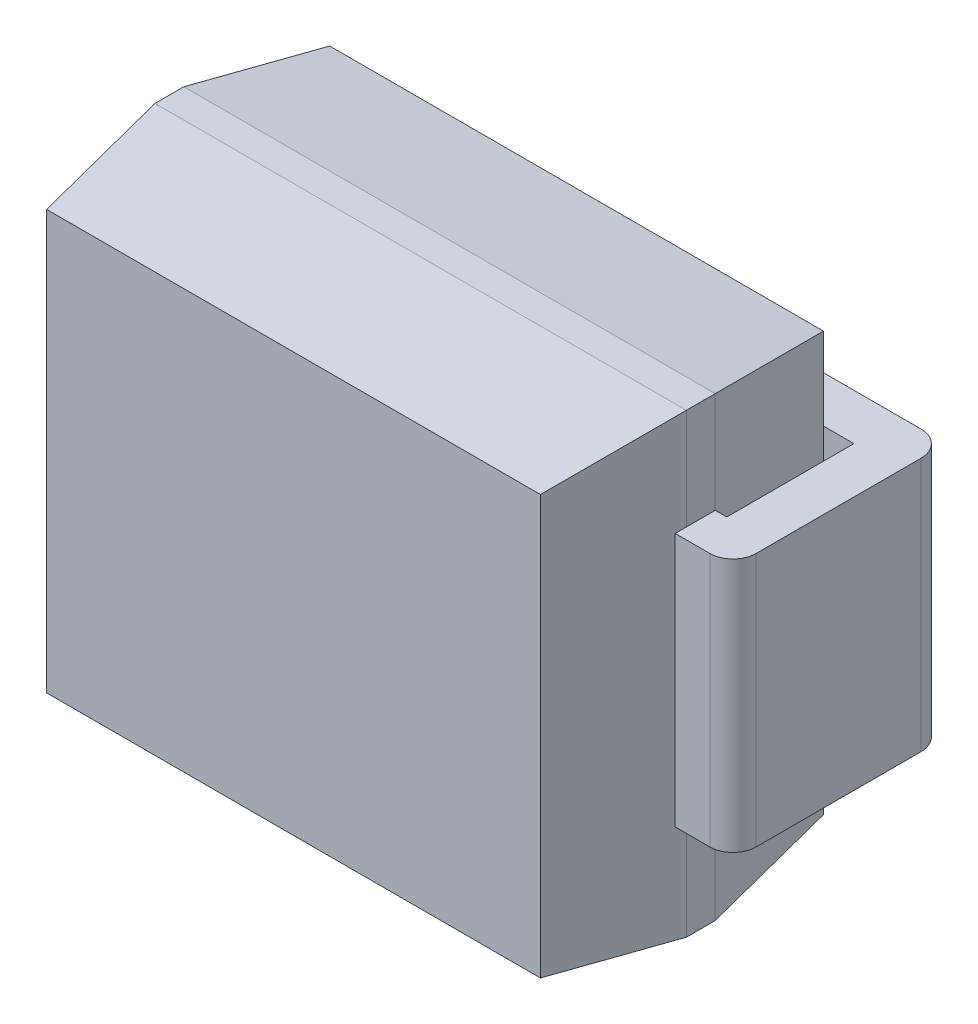
ISO-10303-21;
HEADER;
FILE_DESCRIPTION(('STEP AP214'),'2;1');
FILE_NAME('part.step','',(''),(''),'','','');
FILE_SCHEMA(('AUTOMOTIVE_DESIGN { 1 0 10303 214 1 1 1 1 }'));
ENDSEC;
DATA;
#1=APPLICATION_CONTEXT('core data for automotive mechanical design processes');
#2=APPLICATION_PROTOCOL_DEFINITION('international standard','automotive_design',2000,#1);
#3=PRODUCT_CONTEXT('',#1,'mechanical');
#4=PRODUCT('Part','Part','',(#3));
#5=PRODUCT_RELATED_PRODUCT_CATEGORY('part','',(#4));
#6=PRODUCT_DEFINITION_FORMATION('','',#4);
#7=PRODUCT_DEFINITION_CONTEXT('part definition',#1,'design');
#8=PRODUCT_DEFINITION('design','',#6,#7);
#9=PRODUCT_DEFINITION_SHAPE('','',#8);
#10=(LENGTH_UNIT() NAMED_UNIT(*) SI_UNIT(.MILLI.,.METRE.));
#11=(NAMED_UNIT(*) PLANE_ANGLE_UNIT() SI_UNIT($,.RADIAN.));
#12=(NAMED_UNIT(*) SI_UNIT($,.STERADIAN.) SOLID_ANGLE_UNIT());
#13=UNCERTAINTY_MEASURE_WITH_UNIT(LENGTH_MEASURE(1.E-05),#10,'distance_accuracy_value','');
#14=(GEOMETRIC_REPRESENTATION_CONTEXT(3) GLOBAL_UNCERTAINTY_ASSIGNED_CONTEXT((#13)) GLOBAL_UNIT_ASSIGNED_CONTEXT((#10,
#11,#12)) REPRESENTATION_CONTEXT('',''));
#15=CARTESIAN_POINT('',(0.,0.,0.));
#16=DIRECTION('',(0.,0.,1.));
#17=DIRECTION('',(1.,0.,0.));
#18=AXIS2_PLACEMENT_3D('',#15,#16,#17);
#19=CARTESIAN_POINT('',(2.3,-1.1,1.8464101615138));
#20=DIRECTION('',(-1.,0.,0.));
#21=DIRECTION('',(0.,0.,-1.));
#22=AXIS2_PLACEMENT_3D('',#19,#20,#21);
#23=PLANE('',#22);
#24=DIRECTION('',(0.,1.,0.));
#25=VECTOR('',#24,1.);
#26=CARTESIAN_POINT('',(2.3,-1.1,1.50000000000002));
#27=LINE('',#26,#25);
#28=CARTESIAN_POINT('',(2.3,-1.1,1.50000000000002));
#29=VERTEX_POINT('',#28);
#30=CARTESIAN_POINT('',(2.3,1.1,1.50000000000002));
#31=VERTEX_POINT('',#30);
#32=EDGE_CURVE('E53',#29,#31,#27,.T.);
#33=ORIENTED_EDGE('',*,*,#32,.F.);
#34=DIRECTION('',(0.,0.,-1.));
#35=VECTOR('',#34,1.);
#36=CARTESIAN_POINT('',(2.3,-1.1,1.8464101615138));
#37=LINE('',#36,#35);
#38=CARTESIAN_POINT('',(2.3,-1.1,1.8464101615138));
#39=VERTEX_POINT('',#38);
#40=EDGE_CURVE('E199',#39,#29,#37,.T.);
#41=ORIENTED_EDGE('',*,*,#40,.F.);
#42=DIRECTION('',(0.,1.,0.));
#43=VECTOR('',#42,1.);
#44=CARTESIAN_POINT('',(2.3,-1.1,1.8464101615138));
#45=LINE('',#44,#43);
#46=CARTESIAN_POINT('',(2.3,1.1,1.8464101615138));
#47=VERTEX_POINT('',#46);
#48=EDGE_CURVE('E12',#39,#47,#45,.T.);
#49=ORIENTED_EDGE('',*,*,#48,.T.);
#50=DIRECTION('',(0.,0.,-1.));
#51=VECTOR('',#50,1.);
#52=CARTESIAN_POINT('',(2.3,1.1,1.8464101615138));
#53=LINE('',#52,#51);
#54=EDGE_CURVE('E132',#47,#31,#53,.T.);
#55=ORIENTED_EDGE('',*,*,#54,.T.);
#56=EDGE_LOOP('',(#33,#41,#49,#55));
#57=FACE_BOUND('',#56,.T.);
#58=ADVANCED_FACE('F50',(#57),#23,.T.);
#59=CARTESIAN_POINT('',(2.6,-1.1,1.8464101615138));
#60=DIRECTION('',(0.,0.,1.));
#61=DIRECTION('',(-1.,0.,0.));
#62=AXIS2_PLACEMENT_3D('',#59,#60,#61);
#63=PLANE('',#62);
#64=ORIENTED_EDGE('',*,*,#48,.F.);
#65=DIRECTION('',(-1.,0.,0.));
#66=VECTOR('',#65,1.);
#67=CARTESIAN_POINT('',(2.6,-1.1,1.8464101615138));
#68=LINE('',#67,#66);
#69=CARTESIAN_POINT('',(2.6,-1.1,1.8464101615138));
#70=VERTEX_POINT('',#69);
#71=EDGE_CURVE('E66',#70,#39,#68,.T.);
#72=ORIENTED_EDGE('',*,*,#71,.F.);
#73=DIRECTION('',(0.,1.,0.));
#74=VECTOR('',#73,1.);
#75=CARTESIAN_POINT('',(2.6,-1.1,1.8464101615138));
#76=LINE('',#75,#74);
#77=CARTESIAN_POINT('',(2.6,1.1,1.8464101615138));
#78=VERTEX_POINT('',#77);
#79=EDGE_CURVE('E58',#70,#78,#76,.T.);
#80=ORIENTED_EDGE('',*,*,#79,.T.);
#81=DIRECTION('',(-1.,0.,0.));
#82=VECTOR('',#81,1.);
#83=CARTESIAN_POINT('',(2.6,1.1,1.8464101615138));
#84=LINE('',#83,#82);
#85=EDGE_CURVE('E197',#78,#47,#84,.T.);
#86=ORIENTED_EDGE('',*,*,#85,.T.);
#87=EDGE_LOOP('',(#64,#72,#80,#86));
#88=FACE_BOUND('',#87,.T.);
#89=ADVANCED_FACE('F221',(#88),#63,.T.);
#90=CARTESIAN_POINT('',(2.6,-1.1,1.6464101615138));
#91=DIRECTION('',(0.,1.,0.));
#92=DIRECTION('',(0.,0.,1.));
#93=AXIS2_PLACEMENT_3D('',#90,#91,#92);
#94=CYLINDRICAL_SURFACE('',#93,0.2);
#95=ORIENTED_EDGE('',*,*,#79,.F.);
#96=CARTESIAN_POINT('',(2.6,-1.1,1.6464101615138));
#97=DIRECTION('',(0.,-1.,0.));
#98=DIRECTION('',(0.,0.,-1.));
#99=AXIS2_PLACEMENT_3D('',#96,#97,#98);
#100=CIRCLE('',#99,0.2);
#101=CARTESIAN_POINT('',(2.8,-1.1,1.6464101615138));
#102=VERTEX_POINT('',#101);
#103=EDGE_CURVE('E71',#102,#70,#100,.T.);
#104=ORIENTED_EDGE('',*,*,#103,.F.);
#105=DIRECTION('',(0.,1.,0.));
#106=VECTOR('',#105,1.);
#107=CARTESIAN_POINT('',(2.8,-1.1,1.6464101615138));
#108=LINE('',#107,#106);
#109=CARTESIAN_POINT('',(2.8,1.1,1.6464101615138));
#110=VERTEX_POINT('',#109);
#111=EDGE_CURVE('E155',#102,#110,#108,.T.);
#112=ORIENTED_EDGE('',*,*,#111,.T.);
#113=CARTESIAN_POINT('',(2.6,1.1,1.6464101615138));
#114=DIRECTION('',(0.,-1.,0.));
#115=DIRECTION('',(0.,0.,-1.));
#116=AXIS2_PLACEMENT_3D('',#113,#114,#115);
#117=CIRCLE('',#116,0.2);
#118=EDGE_CURVE('E195',#110,#78,#117,.T.);
#119=ORIENTED_EDGE('',*,*,#118,.T.);
#120=EDGE_LOOP('',(#95,#104,#112,#119));
#121=FACE_BOUND('',#120,.T.);
#122=ADVANCED_FACE('F219',(#121),#94,.T.);
#123=CARTESIAN_POINT('',(2.8,-1.1,1.6464101615138));
#124=DIRECTION('',(1.,0.,0.));
#125=DIRECTION('',(0.,0.,1.));
#126=AXIS2_PLACEMENT_3D('',#123,#124,#125);
#127=PLANE('',#126);
#128=ORIENTED_EDGE('',*,*,#111,.F.);
#129=DIRECTION('',(0.,0.,1.));
#130=VECTOR('',#129,1.);
#131=CARTESIAN_POINT('',(2.8,-1.1,1.6464101615138));
#132=LINE('',#131,#130);
#133=CARTESIAN_POINT('',(2.8,-1.1,0.22));
#134=VERTEX_POINT('',#133);
#135=EDGE_CURVE('E149',#134,#102,#132,.T.);
#136=ORIENTED_EDGE('',*,*,#135,.F.);
#137=DIRECTION('',(0.,1.,0.));
#138=VECTOR('',#137,1.);
#139=CARTESIAN_POINT('',(2.8,-1.1,0.22));
#140=LINE('',#139,#138);
#141=CARTESIAN_POINT('',(2.8,1.1,0.22));
#142=VERTEX_POINT('',#141);
#143=EDGE_CURVE('E158',#134,#142,#140,.T.);
#144=ORIENTED_EDGE('',*,*,#143,.T.);
#145=DIRECTION('',(0.,0.,1.));
#146=VECTOR('',#145,1.);
#147=CARTESIAN_POINT('',(2.8,1.1,1.6464101615138));
#148=LINE('',#147,#146);
#149=EDGE_CURVE('E193',#142,#110,#148,.T.);
#150=ORIENTED_EDGE('',*,*,#149,.T.);
#151=EDGE_LOOP('',(#128,#136,#144,#150));
#152=FACE_BOUND('',#151,.T.);
#153=ADVANCED_FACE('F215',(#152),#127,.T.);
#154=CARTESIAN_POINT('',(2.58,-1.1,0.22));
#155=DIRECTION('',(0.,1.,0.));
#156=DIRECTION('',(0.,0.,1.));
#157=AXIS2_PLACEMENT_3D('',#154,#155,#156);
#158=CYLINDRICAL_SURFACE('',#157,0.22);
#159=ORIENTED_EDGE('',*,*,#143,.F.);
#160=CARTESIAN_POINT('',(2.58,-1.1,0.22));
#161=DIRECTION('',(0.,-1.,0.));
#162=DIRECTION('',(0.,0.,1.));
#163=AXIS2_PLACEMENT_3D('',#160,#161,#162);
#164=CIRCLE('',#163,0.22);
#165=CARTESIAN_POINT('',(2.58,-1.1,0.));
#166=VERTEX_POINT('',#165);
#167=EDGE_CURVE('E208',#166,#134,#164,.T.);
#168=ORIENTED_EDGE('',*,*,#167,.F.);
#169=DIRECTION('',(0.,1.,0.));
#170=VECTOR('',#169,1.);
#171=CARTESIAN_POINT('',(2.58,-1.1,0.));
#172=LINE('',#171,#170);
#173=CARTESIAN_POINT('',(2.58,1.1,0.));
#174=VERTEX_POINT('',#173);
#175=EDGE_CURVE('E161',#166,#174,#172,.T.);
#176=ORIENTED_EDGE('',*,*,#175,.T.);
#177=CARTESIAN_POINT('',(2.58,1.1,0.22));
#178=DIRECTION('',(0.,-1.,0.));
#179=DIRECTION('',(0.,0.,1.));
#180=AXIS2_PLACEMENT_3D('',#177,#178,#179);
#181=CIRCLE('',#180,0.22);
#182=EDGE_CURVE('E191',#174,#142,#181,.T.);
#183=ORIENTED_EDGE('',*,*,#182,.T.);
#184=EDGE_LOOP('',(#159,#168,#176,#183));
#185=FACE_BOUND('',#184,.T.);
#186=ADVANCED_FACE('F232',(#185),#158,.T.);
#187=CARTESIAN_POINT('',(1.3,-1.1,0.));
#188=DIRECTION('',(0.,0.,-1.));
#189=DIRECTION('',(1.,0.,0.));
#190=AXIS2_PLACEMENT_3D('',#187,#188,#189);
#191=PLANE('',#190);
#192=ORIENTED_EDGE('',*,*,#175,.F.);
#193=DIRECTION('',(1.,0.,0.));
#194=VECTOR('',#193,1.);
#195=CARTESIAN_POINT('',(1.3,-1.1,0.));
#196=LINE('',#195,#194);
#197=CARTESIAN_POINT('',(1.3,-1.1,0.));
#198=VERTEX_POINT('',#197);
#199=EDGE_CURVE('E206',#198,#166,#196,.T.);
#200=ORIENTED_EDGE('',*,*,#199,.F.);
#201=DIRECTION('',(0.,1.,0.));
#202=VECTOR('',#201,1.);
#203=CARTESIAN_POINT('',(1.3,-1.1,0.));
#204=LINE('',#203,#202);
#205=CARTESIAN_POINT('',(1.3,1.1,0.));
#206=VERTEX_POINT('',#205);
#207=EDGE_CURVE('E164',#198,#206,#204,.T.);
#208=ORIENTED_EDGE('',*,*,#207,.T.);
#209=DIRECTION('',(1.,0.,0.));
#210=VECTOR('',#209,1.);
#211=CARTESIAN_POINT('',(1.3,1.1,0.));
#212=LINE('',#211,#210);
#213=EDGE_CURVE('E187',#206,#174,#212,.T.);
#214=ORIENTED_EDGE('',*,*,#213,.T.);
#215=EDGE_LOOP('',(#192,#200,#208,#214));
#216=FACE_BOUND('',#215,.T.);
#217=ADVANCED_FACE('F229',(#216),#191,.T.);
#218=CARTESIAN_POINT('',(1.3,-1.1,0.));
#219=DIRECTION('',(-1.,0.,0.));
#220=DIRECTION('',(0.,0.,-1.));
#221=AXIS2_PLACEMENT_3D('',#218,#219,#220);
#222=PLANE('',#221);
#223=ORIENTED_EDGE('',*,*,#207,.F.);
#224=DIRECTION('',(0.,0.,-1.));
#225=VECTOR('',#224,1.);
#226=CARTESIAN_POINT('',(1.3,-1.1,0.));
#227=LINE('',#226,#225);
#228=CARTESIAN_POINT('',(1.3,-1.1,0.4));
#229=VERTEX_POINT('',#228);
#230=EDGE_CURVE('E204',#229,#198,#227,.T.);
#231=ORIENTED_EDGE('',*,*,#230,.F.);
#232=DIRECTION('',(0.,1.,0.));
#233=VECTOR('',#232,1.);
#234=CARTESIAN_POINT('',(1.3,-1.1,0.4));
#235=LINE('',#234,#233);
#236=CARTESIAN_POINT('',(1.3,1.1,0.4));
#237=VERTEX_POINT('',#236);
#238=EDGE_CURVE('E167',#229,#237,#235,.T.);
#239=ORIENTED_EDGE('',*,*,#238,.T.);
#240=DIRECTION('',(0.,0.,-1.));
#241=VECTOR('',#240,1.);
#242=CARTESIAN_POINT('',(1.3,1.1,0.));
#243=LINE('',#242,#241);
#244=EDGE_CURVE('E185',#237,#206,#243,.T.);
#245=ORIENTED_EDGE('',*,*,#244,.T.);
#246=EDGE_LOOP('',(#223,#231,#239,#245));
#247=FACE_BOUND('',#246,.T.);
#248=ADVANCED_FACE('F225',(#247),#222,.T.);
#249=CARTESIAN_POINT('',(1.3,-1.1,0.4));
#250=DIRECTION('',(0.,0.,1.));
#251=DIRECTION('',(-1.,0.,0.));
#252=AXIS2_PLACEMENT_3D('',#249,#250,#251);
#253=PLANE('',#252);
#254=ORIENTED_EDGE('',*,*,#238,.F.);
#255=DIRECTION('',(-1.,0.,0.));
#256=VECTOR('',#255,1.);
#257=CARTESIAN_POINT('',(1.3,-1.1,0.4));
#258=LINE('',#257,#256);
#259=CARTESIAN_POINT('',(2.4,-1.1,0.4));
#260=VERTEX_POINT('',#259);
#261=EDGE_CURVE('E178',#260,#229,#258,.T.);
#262=ORIENTED_EDGE('',*,*,#261,.F.);
#263=DIRECTION('',(0.,1.,0.));
#264=VECTOR('',#263,1.);
#265=CARTESIAN_POINT('',(2.4,-1.1,0.4));
#266=LINE('',#265,#264);
#267=CARTESIAN_POINT('',(2.4,1.1,0.4));
#268=VERTEX_POINT('',#267);
#269=EDGE_CURVE('E147',#260,#268,#266,.T.);
#270=ORIENTED_EDGE('',*,*,#269,.T.);
#271=DIRECTION('',(-1.,0.,0.));
#272=VECTOR('',#271,1.);
#273=CARTESIAN_POINT('',(1.3,1.1,0.4));
#274=LINE('',#273,#272);
#275=EDGE_CURVE('E176',#268,#237,#274,.T.);
#276=ORIENTED_EDGE('',*,*,#275,.T.);
#277=EDGE_LOOP('',(#254,#262,#270,#276));
#278=FACE_BOUND('',#277,.T.);
#279=ADVANCED_FACE('F175',(#278),#253,.T.);
#280=CARTESIAN_POINT('',(2.4,-1.1,0.4));
#281=DIRECTION('',(-1.,0.,0.));
#282=DIRECTION('',(0.,0.,-1.));
#283=AXIS2_PLACEMENT_3D('',#280,#281,#282);
#284=PLANE('',#283);
#285=ORIENTED_EDGE('',*,*,#269,.F.);
#286=DIRECTION('',(0.,0.,-1.));
#287=VECTOR('',#286,1.);
#288=CARTESIAN_POINT('',(2.4,-1.1,0.4));
#289=LINE('',#288,#287);
#290=CARTESIAN_POINT('',(2.4,-1.1,1.50000000000002));
#291=VERTEX_POINT('',#290);
#292=EDGE_CURVE('E182',#291,#260,#289,.T.);
#293=ORIENTED_EDGE('',*,*,#292,.F.);
#294=DIRECTION('',(0.,1.,0.));
#295=VECTOR('',#294,1.);
#296=CARTESIAN_POINT('',(2.4,-1.1,1.50000000000002));
#297=LINE('',#296,#295);
#298=CARTESIAN_POINT('',(2.4,1.1,1.50000000000002));
#299=VERTEX_POINT('',#298);
#300=EDGE_CURVE('E146',#291,#299,#297,.T.);
#301=ORIENTED_EDGE('',*,*,#300,.T.);
#302=DIRECTION('',(0.,0.,-1.));
#303=VECTOR('',#302,1.);
#304=CARTESIAN_POINT('',(2.4,1.1,0.4));
#305=LINE('',#304,#303);
#306=EDGE_CURVE('E134',#299,#268,#305,.T.);
#307=ORIENTED_EDGE('',*,*,#306,.T.);
#308=EDGE_LOOP('',(#285,#293,#301,#307));
#309=FACE_BOUND('',#308,.T.);
#310=ADVANCED_FACE('F181',(#309),#284,.T.);
#311=CARTESIAN_POINT('',(2.3,-1.1,1.50000000000002));
#312=DIRECTION('',(0.,0.,-1.));
#313=DIRECTION('',(1.,0.,0.));
#314=AXIS2_PLACEMENT_3D('',#311,#312,#313);
#315=PLANE('',#314);
#316=ORIENTED_EDGE('',*,*,#300,.F.);
#317=DIRECTION('',(1.,0.,0.));
#318=VECTOR('',#317,1.);
#319=CARTESIAN_POINT('',(2.3,-1.1,1.50000000000002));
#320=LINE('',#319,#318);
#321=EDGE_CURVE('E145',#29,#291,#320,.T.);
#322=ORIENTED_EDGE('',*,*,#321,.F.);
#323=ORIENTED_EDGE('',*,*,#32,.T.);
#324=DIRECTION('',(1.,0.,0.));
#325=VECTOR('',#324,1.);
#326=CARTESIAN_POINT('',(2.3,1.1,1.50000000000002));
#327=LINE('',#326,#325);
#328=EDGE_CURVE('E128',#31,#299,#327,.T.);
#329=ORIENTED_EDGE('',*,*,#328,.T.);
#330=EDGE_LOOP('',(#316,#322,#323,#329));
#331=FACE_BOUND('',#330,.T.);
#332=ADVANCED_FACE('F144',(#331),#315,.T.);
#333=CARTESIAN_POINT('',(2.58,-1.1,0.22));
#334=DIRECTION('',(0.,1.,0.));
#335=DIRECTION('',(0.,0.,1.));
#336=AXIS2_PLACEMENT_3D('',#333,#334,#335);
#337=PLANE('',#336);
#338=ORIENTED_EDGE('',*,*,#40,.T.);
#339=ORIENTED_EDGE('',*,*,#321,.T.);
#340=ORIENTED_EDGE('',*,*,#292,.T.);
#341=ORIENTED_EDGE('',*,*,#261,.T.);
#342=ORIENTED_EDGE('',*,*,#230,.T.);
#343=ORIENTED_EDGE('',*,*,#199,.T.);
#344=ORIENTED_EDGE('',*,*,#167,.T.);
#345=ORIENTED_EDGE('',*,*,#135,.T.);
#346=ORIENTED_EDGE('',*,*,#103,.T.);
#347=ORIENTED_EDGE('',*,*,#71,.T.);
#348=EDGE_LOOP('',(#338,#339,#340,#341,#342,#343,#344,#345,#346,#347));
#349=FACE_BOUND('',#348,.T.);
#350=ADVANCED_FACE('F211',(#349),#337,.F.);
#351=CARTESIAN_POINT('',(2.58,1.1,0.22));
#352=DIRECTION('',(0.,1.,0.));
#353=DIRECTION('',(0.,0.,1.));
#354=AXIS2_PLACEMENT_3D('',#351,#352,#353);
#355=PLANE('',#354);
#356=ORIENTED_EDGE('',*,*,#54,.F.);
#357=ORIENTED_EDGE('',*,*,#85,.F.);
#358=ORIENTED_EDGE('',*,*,#118,.F.);
#359=ORIENTED_EDGE('',*,*,#149,.F.);
#360=ORIENTED_EDGE('',*,*,#182,.F.);
#361=ORIENTED_EDGE('',*,*,#213,.F.);
#362=ORIENTED_EDGE('',*,*,#244,.F.);
#363=ORIENTED_EDGE('',*,*,#275,.F.);
#364=ORIENTED_EDGE('',*,*,#306,.F.);
#365=ORIENTED_EDGE('',*,*,#328,.F.);
#366=EDGE_LOOP('',(#356,#357,#358,#359,#360,#361,#362,#363,#364,#365));
#367=FACE_BOUND('',#366,.T.);
#368=ADVANCED_FACE('F130',(#367),#355,.T.);
#369=CLOSED_SHELL('',(#58,#89,#122,#153,#186,#217,#248,#279,#310,#332,#350,#368));
#370=MANIFOLD_SOLID_BREP('B2',#369);
#371=CARTESIAN_POINT('',(-2.3,-1.1,1.8464101615138));
#372=DIRECTION('',(1.,0.,0.));
#373=DIRECTION('',(0.,0.,-1.));
#374=AXIS2_PLACEMENT_3D('',#371,#372,#373);
#375=PLANE('',#374);
#376=DIRECTION('',(0.,1.,0.));
#377=VECTOR('',#376,1.);
#378=CARTESIAN_POINT('',(-2.3,-1.1,1.50000000000002));
#379=LINE('',#378,#377);
#380=CARTESIAN_POINT('',(-2.3,-1.1,1.50000000000002));
#381=VERTEX_POINT('',#380);
#382=CARTESIAN_POINT('',(-2.3,1.1,1.50000000000002));
#383=VERTEX_POINT('',#382);
#384=EDGE_CURVE('E366',#381,#383,#379,.T.);
#385=ORIENTED_EDGE('',*,*,#384,.T.);
#386=DIRECTION('',(0.,0.,-1.));
#387=VECTOR('',#386,1.);
#388=CARTESIAN_POINT('',(-2.3,1.1,1.8464101615138));
#389=LINE('',#388,#387);
#390=CARTESIAN_POINT('',(-2.3,1.1,1.8464101615138));
#391=VERTEX_POINT('',#390);
#392=EDGE_CURVE('E439',#391,#383,#389,.T.);
#393=ORIENTED_EDGE('',*,*,#392,.F.);
#394=DIRECTION('',(0.,1.,0.));
#395=VECTOR('',#394,1.);
#396=CARTESIAN_POINT('',(-2.3,-1.1,1.8464101615138));
#397=LINE('',#396,#395);
#398=CARTESIAN_POINT('',(-2.3,-1.1,1.8464101615138));
#399=VERTEX_POINT('',#398);
#400=EDGE_CURVE('E48',#399,#391,#397,.T.);
#401=ORIENTED_EDGE('',*,*,#400,.F.);
#402=DIRECTION('',(0.,0.,-1.));
#403=VECTOR('',#402,1.);
#404=CARTESIAN_POINT('',(-2.3,-1.1,1.8464101615138));
#405=LINE('',#404,#403);
#406=EDGE_CURVE('E440',#399,#381,#405,.T.);
#407=ORIENTED_EDGE('',*,*,#406,.T.);
#408=EDGE_LOOP('',(#385,#393,#401,#407));
#409=FACE_BOUND('',#408,.T.);
#410=ADVANCED_FACE('F363',(#409),#375,.T.);
#411=CARTESIAN_POINT('',(-2.6,-1.1,1.8464101615138));
#412=DIRECTION('',(0.,0.,1.));
#413=DIRECTION('',(1.,0.,0.));
#414=AXIS2_PLACEMENT_3D('',#411,#412,#413);
#415=PLANE('',#414);
#416=ORIENTED_EDGE('',*,*,#400,.T.);
#417=DIRECTION('',(1.,0.,0.));
#418=VECTOR('',#417,1.);
#419=CARTESIAN_POINT('',(-2.6,1.1,1.8464101615138));
#420=LINE('',#419,#418);
#421=CARTESIAN_POINT('',(-2.6,1.1,1.8464101615138));
#422=VERTEX_POINT('',#421);
#423=EDGE_CURVE('E457',#422,#391,#420,.T.);
#424=ORIENTED_EDGE('',*,*,#423,.F.);
#425=DIRECTION('',(0.,1.,0.));
#426=VECTOR('',#425,1.);
#427=CARTESIAN_POINT('',(-2.6,-1.1,1.8464101615138));
#428=LINE('',#427,#426);
#429=CARTESIAN_POINT('',(-2.6,-1.1,1.8464101615138));
#430=VERTEX_POINT('',#429);
#431=EDGE_CURVE('E371',#430,#422,#428,.T.);
#432=ORIENTED_EDGE('',*,*,#431,.F.);
#433=DIRECTION('',(1.,0.,0.));
#434=VECTOR('',#433,1.);
#435=CARTESIAN_POINT('',(-2.6,-1.1,1.8464101615138));
#436=LINE('',#435,#434);
#437=EDGE_CURVE('E445',#430,#399,#436,.T.);
#438=ORIENTED_EDGE('',*,*,#437,.T.);
#439=EDGE_LOOP('',(#416,#424,#432,#438));
#440=FACE_BOUND('',#439,.T.);
#441=ADVANCED_FACE('F545',(#440),#415,.T.);
#442=CARTESIAN_POINT('',(-2.6,-1.1,1.6464101615138));
#443=DIRECTION('',(0.,1.,0.));
#444=DIRECTION('',(0.,0.,1.));
#445=AXIS2_PLACEMENT_3D('',#442,#443,#444);
#446=CYLINDRICAL_SURFACE('',#445,0.2);
#447=ORIENTED_EDGE('',*,*,#431,.T.);
#448=CARTESIAN_POINT('',(-2.6,1.1,1.6464101615138));
#449=DIRECTION('',(0.,1.,0.));
#450=DIRECTION('',(0.,0.,-1.));
#451=AXIS2_PLACEMENT_3D('',#448,#449,#450);
#452=CIRCLE('',#451,0.2);
#453=CARTESIAN_POINT('',(-2.8,1.1,1.6464101615138));
#454=VERTEX_POINT('',#453);
#455=EDGE_CURVE('E476',#454,#422,#452,.T.);
#456=ORIENTED_EDGE('',*,*,#455,.F.);
#457=DIRECTION('',(0.,1.,0.));
#458=VECTOR('',#457,1.);
#459=CARTESIAN_POINT('',(-2.8,-1.1,1.6464101615138));
#460=LINE('',#459,#458);
#461=CARTESIAN_POINT('',(-2.8,-1.1,1.6464101615138));
#462=VERTEX_POINT('',#461);
#463=EDGE_CURVE('E504',#462,#454,#460,.T.);
#464=ORIENTED_EDGE('',*,*,#463,.F.);
#465=CARTESIAN_POINT('',(-2.6,-1.1,1.6464101615138));
#466=DIRECTION('',(0.,1.,0.));
#467=DIRECTION('',(0.,0.,-1.));
#468=AXIS2_PLACEMENT_3D('',#465,#466,#467);
#469=CIRCLE('',#468,0.2);
#470=EDGE_CURVE('E500',#462,#430,#469,.T.);
#471=ORIENTED_EDGE('',*,*,#470,.T.);
#472=EDGE_LOOP('',(#447,#456,#464,#471));
#473=FACE_BOUND('',#472,.T.);
#474=ADVANCED_FACE('F543',(#473),#446,.T.);
#475=CARTESIAN_POINT('',(-2.8,-1.1,1.6464101615138));
#476=DIRECTION('',(-1.,0.,0.));
#477=DIRECTION('',(0.,0.,1.));
#478=AXIS2_PLACEMENT_3D('',#475,#476,#477);
#479=PLANE('',#478);
#480=ORIENTED_EDGE('',*,*,#463,.T.);
#481=DIRECTION('',(0.,0.,1.));
#482=VECTOR('',#481,1.);
#483=CARTESIAN_POINT('',(-2.8,1.1,1.6464101615138));
#484=LINE('',#483,#482);
#485=CARTESIAN_POINT('',(-2.8,1.1,0.22));
#486=VERTEX_POINT('',#485);
#487=EDGE_CURVE('E473',#486,#454,#484,.T.);
#488=ORIENTED_EDGE('',*,*,#487,.F.);
#489=DIRECTION('',(0.,1.,0.));
#490=VECTOR('',#489,1.);
#491=CARTESIAN_POINT('',(-2.8,-1.1,0.22));
#492=LINE('',#491,#490);
#493=CARTESIAN_POINT('',(-2.8,-1.1,0.22));
#494=VERTEX_POINT('',#493);
#495=EDGE_CURVE('E506',#494,#486,#492,.T.);
#496=ORIENTED_EDGE('',*,*,#495,.F.);
#497=DIRECTION('',(0.,0.,1.));
#498=VECTOR('',#497,1.);
#499=CARTESIAN_POINT('',(-2.8,-1.1,1.6464101615138));
#500=LINE('',#499,#498);
#501=EDGE_CURVE('E497',#494,#462,#500,.T.);
#502=ORIENTED_EDGE('',*,*,#501,.T.);
#503=EDGE_LOOP('',(#480,#488,#496,#502));
#504=FACE_BOUND('',#503,.T.);
#505=ADVANCED_FACE('F539',(#504),#479,.T.);
#506=CARTESIAN_POINT('',(-2.58,-1.1,0.22));
#507=DIRECTION('',(0.,1.,0.));
#508=DIRECTION('',(0.,0.,1.));
#509=AXIS2_PLACEMENT_3D('',#506,#507,#508);
#510=CYLINDRICAL_SURFACE('',#509,0.22);
#511=ORIENTED_EDGE('',*,*,#495,.T.);
#512=CARTESIAN_POINT('',(-2.58,1.1,0.22));
#513=DIRECTION('',(0.,1.,0.));
#514=DIRECTION('',(0.,0.,1.));
#515=AXIS2_PLACEMENT_3D('',#512,#513,#514);
#516=CIRCLE('',#515,0.22);
#517=CARTESIAN_POINT('',(-2.58,1.1,0.));
#518=VERTEX_POINT('',#517);
#519=EDGE_CURVE('E470',#518,#486,#516,.T.);
#520=ORIENTED_EDGE('',*,*,#519,.F.);
#521=DIRECTION('',(0.,1.,0.));
#522=VECTOR('',#521,1.);
#523=CARTESIAN_POINT('',(-2.58,-1.1,0.));
#524=LINE('',#523,#522);
#525=CARTESIAN_POINT('',(-2.58,-1.1,0.));
#526=VERTEX_POINT('',#525);
#527=EDGE_CURVE('E508',#526,#518,#524,.T.);
#528=ORIENTED_EDGE('',*,*,#527,.F.);
#529=CARTESIAN_POINT('',(-2.58,-1.1,0.22));
#530=DIRECTION('',(0.,1.,0.));
#531=DIRECTION('',(0.,0.,1.));
#532=AXIS2_PLACEMENT_3D('',#529,#530,#531);
#533=CIRCLE('',#532,0.22);
#534=EDGE_CURVE('E494',#526,#494,#533,.T.);
#535=ORIENTED_EDGE('',*,*,#534,.T.);
#536=EDGE_LOOP('',(#511,#520,#528,#535));
#537=FACE_BOUND('',#536,.T.);
#538=ADVANCED_FACE('F537',(#537),#510,.T.);
#539=CARTESIAN_POINT('',(-1.3,-1.1,0.));
#540=DIRECTION('',(0.,0.,-1.));
#541=DIRECTION('',(-1.,0.,0.));
#542=AXIS2_PLACEMENT_3D('',#539,#540,#541);
#543=PLANE('',#542);
#544=ORIENTED_EDGE('',*,*,#527,.T.);
#545=DIRECTION('',(-1.,0.,0.));
#546=VECTOR('',#545,1.);
#547=CARTESIAN_POINT('',(-1.3,1.1,0.));
#548=LINE('',#547,#546);
#549=CARTESIAN_POINT('',(-1.3,1.1,0.));
#550=VERTEX_POINT('',#549);
#551=EDGE_CURVE('E467',#550,#518,#548,.T.);
#552=ORIENTED_EDGE('',*,*,#551,.F.);
#553=DIRECTION('',(0.,1.,0.));
#554=VECTOR('',#553,1.);
#555=CARTESIAN_POINT('',(-1.3,-1.1,0.));
#556=LINE('',#555,#554);
#557=CARTESIAN_POINT('',(-1.3,-1.1,0.));
#558=VERTEX_POINT('',#557);
#559=EDGE_CURVE('E510',#558,#550,#556,.T.);
#560=ORIENTED_EDGE('',*,*,#559,.F.);
#561=DIRECTION('',(-1.,0.,0.));
#562=VECTOR('',#561,1.);
#563=CARTESIAN_POINT('',(-1.3,-1.1,0.));
#564=LINE('',#563,#562);
#565=EDGE_CURVE('E491',#558,#526,#564,.T.);
#566=ORIENTED_EDGE('',*,*,#565,.T.);
#567=EDGE_LOOP('',(#544,#552,#560,#566));
#568=FACE_BOUND('',#567,.T.);
#569=ADVANCED_FACE('F532',(#568),#543,.T.);
#570=CARTESIAN_POINT('',(-1.3,-1.1,0.));
#571=DIRECTION('',(1.,0.,0.));
#572=DIRECTION('',(0.,0.,-1.));
#573=AXIS2_PLACEMENT_3D('',#570,#571,#572);
#574=PLANE('',#573);
#575=ORIENTED_EDGE('',*,*,#559,.T.);
#576=DIRECTION('',(0.,0.,-1.));
#577=VECTOR('',#576,1.);
#578=CARTESIAN_POINT('',(-1.3,1.1,0.));
#579=LINE('',#578,#577);
#580=CARTESIAN_POINT('',(-1.3,1.1,0.4));
#581=VERTEX_POINT('',#580);
#582=EDGE_CURVE('E464',#581,#550,#579,.T.);
#583=ORIENTED_EDGE('',*,*,#582,.F.);
#584=DIRECTION('',(0.,1.,0.));
#585=VECTOR('',#584,1.);
#586=CARTESIAN_POINT('',(-1.3,-1.1,0.4));
#587=LINE('',#586,#585);
#588=CARTESIAN_POINT('',(-1.3,-1.1,0.4));
#589=VERTEX_POINT('',#588);
#590=EDGE_CURVE('E512',#589,#581,#587,.T.);
#591=ORIENTED_EDGE('',*,*,#590,.F.);
#592=DIRECTION('',(0.,0.,-1.));
#593=VECTOR('',#592,1.);
#594=CARTESIAN_POINT('',(-1.3,-1.1,0.));
#595=LINE('',#594,#593);
#596=EDGE_CURVE('E488',#589,#558,#595,.T.);
#597=ORIENTED_EDGE('',*,*,#596,.T.);
#598=EDGE_LOOP('',(#575,#583,#591,#597));
#599=FACE_BOUND('',#598,.T.);
#600=ADVANCED_FACE('F525',(#599),#574,.T.);
#601=CARTESIAN_POINT('',(-1.3,-1.1,0.4));
#602=DIRECTION('',(0.,0.,1.));
#603=DIRECTION('',(1.,0.,0.));
#604=AXIS2_PLACEMENT_3D('',#601,#602,#603);
#605=PLANE('',#604);
#606=ORIENTED_EDGE('',*,*,#590,.T.);
#607=DIRECTION('',(1.,0.,0.));
#608=VECTOR('',#607,1.);
#609=CARTESIAN_POINT('',(-1.3,1.1,0.4));
#610=LINE('',#609,#608);
#611=CARTESIAN_POINT('',(-2.4,1.1,0.4));
#612=VERTEX_POINT('',#611);
#613=EDGE_CURVE('E461',#612,#581,#610,.T.);
#614=ORIENTED_EDGE('',*,*,#613,.F.);
#615=DIRECTION('',(0.,1.,0.));
#616=VECTOR('',#615,1.);
#617=CARTESIAN_POINT('',(-2.4,-1.1,0.4));
#618=LINE('',#617,#616);
#619=CARTESIAN_POINT('',(-2.4,-1.1,0.4));
#620=VERTEX_POINT('',#619);
#621=EDGE_CURVE('E514',#620,#612,#618,.T.);
#622=ORIENTED_EDGE('',*,*,#621,.F.);
#623=DIRECTION('',(1.,0.,0.));
#624=VECTOR('',#623,1.);
#625=CARTESIAN_POINT('',(-1.3,-1.1,0.4));
#626=LINE('',#625,#624);
#627=EDGE_CURVE('E485',#620,#589,#626,.T.);
#628=ORIENTED_EDGE('',*,*,#627,.T.);
#629=EDGE_LOOP('',(#606,#614,#622,#628));
#630=FACE_BOUND('',#629,.T.);
#631=ADVANCED_FACE('F522',(#630),#605,.T.);
#632=CARTESIAN_POINT('',(-2.4,-1.1,0.4));
#633=DIRECTION('',(1.,0.,0.));
#634=DIRECTION('',(0.,0.,-1.));
#635=AXIS2_PLACEMENT_3D('',#632,#633,#634);
#636=PLANE('',#635);
#637=ORIENTED_EDGE('',*,*,#621,.T.);
#638=DIRECTION('',(0.,0.,-1.));
#639=VECTOR('',#638,1.);
#640=CARTESIAN_POINT('',(-2.4,1.1,0.4));
#641=LINE('',#640,#639);
#642=CARTESIAN_POINT('',(-2.4,1.1,1.50000000000002));
#643=VERTEX_POINT('',#642);
#644=EDGE_CURVE('E452',#643,#612,#641,.T.);
#645=ORIENTED_EDGE('',*,*,#644,.F.);
#646=DIRECTION('',(0.,1.,0.));
#647=VECTOR('',#646,1.);
#648=CARTESIAN_POINT('',(-2.4,-1.1,1.50000000000002));
#649=LINE('',#648,#647);
#650=CARTESIAN_POINT('',(-2.4,-1.1,1.50000000000002));
#651=VERTEX_POINT('',#650);
#652=EDGE_CURVE('E444',#651,#643,#649,.T.);
#653=ORIENTED_EDGE('',*,*,#652,.F.);
#654=DIRECTION('',(0.,0.,-1.));
#655=VECTOR('',#654,1.);
#656=CARTESIAN_POINT('',(-2.4,-1.1,0.4));
#657=LINE('',#656,#655);
#658=EDGE_CURVE('E482',#651,#620,#657,.T.);
#659=ORIENTED_EDGE('',*,*,#658,.T.);
#660=EDGE_LOOP('',(#637,#645,#653,#659));
#661=FACE_BOUND('',#660,.T.);
#662=ADVANCED_FACE('F516',(#661),#636,.T.);
#663=CARTESIAN_POINT('',(-2.3,-1.1,1.50000000000002));
#664=DIRECTION('',(0.,0.,-1.));
#665=DIRECTION('',(-1.,0.,0.));
#666=AXIS2_PLACEMENT_3D('',#663,#664,#665);
#667=PLANE('',#666);
#668=ORIENTED_EDGE('',*,*,#652,.T.);
#669=DIRECTION('',(-1.,0.,0.));
#670=VECTOR('',#669,1.);
#671=CARTESIAN_POINT('',(-2.3,1.1,1.50000000000002));
#672=LINE('',#671,#670);
#673=EDGE_CURVE('E447',#383,#643,#672,.T.);
#674=ORIENTED_EDGE('',*,*,#673,.F.);
#675=ORIENTED_EDGE('',*,*,#384,.F.);
#676=DIRECTION('',(-1.,0.,0.));
#677=VECTOR('',#676,1.);
#678=CARTESIAN_POINT('',(-2.3,-1.1,1.50000000000002));
#679=LINE('',#678,#677);
#680=EDGE_CURVE('E480',#381,#651,#679,.T.);
#681=ORIENTED_EDGE('',*,*,#680,.T.);
#682=EDGE_LOOP('',(#668,#674,#675,#681));
#683=FACE_BOUND('',#682,.T.);
#684=ADVANCED_FACE('F448',(#683),#667,.T.);
#685=CARTESIAN_POINT('',(-2.58,-1.1,0.22));
#686=DIRECTION('',(0.,1.,0.));
#687=DIRECTION('',(0.,0.,1.));
#688=AXIS2_PLACEMENT_3D('',#685,#686,#687);
#689=PLANE('',#688);
#690=ORIENTED_EDGE('',*,*,#406,.F.);
#691=ORIENTED_EDGE('',*,*,#437,.F.);
#692=ORIENTED_EDGE('',*,*,#470,.F.);
#693=ORIENTED_EDGE('',*,*,#501,.F.);
#694=ORIENTED_EDGE('',*,*,#534,.F.);
#695=ORIENTED_EDGE('',*,*,#565,.F.);
#696=ORIENTED_EDGE('',*,*,#596,.F.);
#697=ORIENTED_EDGE('',*,*,#627,.F.);
#698=ORIENTED_EDGE('',*,*,#658,.F.);
#699=ORIENTED_EDGE('',*,*,#680,.F.);
#700=EDGE_LOOP('',(#690,#691,#692,#693,#694,#695,#696,#697,#698,#699));
#701=FACE_BOUND('',#700,.T.);
#702=ADVANCED_FACE('F528',(#701),#689,.F.);
#703=CARTESIAN_POINT('',(-2.58,1.1,0.22));
#704=DIRECTION('',(0.,1.,0.));
#705=DIRECTION('',(0.,0.,1.));
#706=AXIS2_PLACEMENT_3D('',#703,#704,#705);
#707=PLANE('',#706);
#708=ORIENTED_EDGE('',*,*,#392,.T.);
#709=ORIENTED_EDGE('',*,*,#673,.T.);
#710=ORIENTED_EDGE('',*,*,#644,.T.);
#711=ORIENTED_EDGE('',*,*,#613,.T.);
#712=ORIENTED_EDGE('',*,*,#582,.T.);
#713=ORIENTED_EDGE('',*,*,#551,.T.);
#714=ORIENTED_EDGE('',*,*,#519,.T.);
#715=ORIENTED_EDGE('',*,*,#487,.T.);
#716=ORIENTED_EDGE('',*,*,#455,.T.);
#717=ORIENTED_EDGE('',*,*,#423,.T.);
#718=EDGE_LOOP('',(#708,#709,#710,#711,#712,#713,#714,#715,#716,#717));
#719=FACE_BOUND('',#718,.T.);
#720=ADVANCED_FACE('F455',(#719),#707,.T.);
#721=CLOSED_SHELL('',(#410,#441,#474,#505,#538,#569,#600,#631,#662,#684,#702,#720));
#722=MANIFOLD_SOLID_BREP('B6',#721);
#723=CARTESIAN_POINT('',(2.3,1.975,2.85));
#724=DIRECTION('',(-1.,0.,0.));
#725=DIRECTION('',(0.,-1.,0.));
#726=AXIS2_PLACEMENT_3D('',#723,#724,#725);
#727=PLANE('',#726);
#728=DIRECTION('',(0.,0.,-1.));
#729=VECTOR('',#728,1.);
#730=CARTESIAN_POINT('',(2.3,-1.975,2.85));
#731=LINE('',#730,#729);
#732=CARTESIAN_POINT('',(2.3,-1.975,1.74999999999998));
#733=VERTEX_POINT('',#732);
#734=CARTESIAN_POINT('',(2.3,-1.975,1.50000000000002));
#735=VERTEX_POINT('',#734);
#736=EDGE_CURVE('E754',#733,#735,#731,.T.);
#737=ORIENTED_EDGE('',*,*,#736,.T.);
#738=DIRECTION('',(0.,1.,0.));
#739=VECTOR('',#738,1.);
#740=CARTESIAN_POINT('',(2.3,1.975,1.50000000000002));
#741=LINE('',#740,#739);
#742=CARTESIAN_POINT('',(2.3,1.975,1.50000000000002));
#743=VERTEX_POINT('',#742);
#744=EDGE_CURVE('E747',#735,#743,#741,.T.);
#745=ORIENTED_EDGE('',*,*,#744,.T.);
#746=DIRECTION('',(0.,0.,-1.));
#747=VECTOR('',#746,1.);
#748=CARTESIAN_POINT('',(2.3,1.975,2.85));
#749=LINE('',#748,#747);
#750=CARTESIAN_POINT('',(2.3,1.975,1.74999999999998));
#751=VERTEX_POINT('',#750);
#752=EDGE_CURVE('E731',#751,#743,#749,.T.);
#753=ORIENTED_EDGE('',*,*,#752,.F.);
#754=DIRECTION('',(0.,-1.,0.));
#755=VECTOR('',#754,1.);
#756=CARTESIAN_POINT('',(2.3,-1.975,1.74999999999998));
#757=LINE('',#756,#755);
#758=EDGE_CURVE('E738',#751,#733,#757,.T.);
#759=ORIENTED_EDGE('',*,*,#758,.T.);
#760=EDGE_LOOP('',(#737,#745,#753,#759));
#761=FACE_BOUND('',#760,.T.);
#762=ADVANCED_FACE('F643',(#761),#727,.F.);
#763=CARTESIAN_POINT('',(-2.3,1.975,2.85));
#764=DIRECTION('',(0.,-1.,0.));
#765=DIRECTION('',(0.,0.,-1.));
#766=AXIS2_PLACEMENT_3D('',#763,#764,#765);
#767=PLANE('',#766);
#768=ORIENTED_EDGE('',*,*,#752,.T.);
#769=DIRECTION('',(-1.,0.,0.));
#770=VECTOR('',#769,1.);
#771=CARTESIAN_POINT('',(-2.3,1.975,1.50000000000002));
#772=LINE('',#771,#770);
#773=CARTESIAN_POINT('',(-2.3,1.975,1.50000000000002));
#774=VERTEX_POINT('',#773);
#775=EDGE_CURVE('E666',#743,#774,#772,.T.);
#776=ORIENTED_EDGE('',*,*,#775,.T.);
#777=DIRECTION('',(0.,0.,-1.));
#778=VECTOR('',#777,1.);
#779=CARTESIAN_POINT('',(-2.3,1.975,2.85));
#780=LINE('',#779,#778);
#781=CARTESIAN_POINT('',(-2.3,1.975,1.74999999999998));
#782=VERTEX_POINT('',#781);
#783=EDGE_CURVE('E798',#782,#774,#780,.T.);
#784=ORIENTED_EDGE('',*,*,#783,.F.);
#785=DIRECTION('',(1.,0.,0.));
#786=VECTOR('',#785,1.);
#787=CARTESIAN_POINT('',(2.3,1.975,1.74999999999998));
#788=LINE('',#787,#786);
#789=EDGE_CURVE('E718',#782,#751,#788,.T.);
#790=ORIENTED_EDGE('',*,*,#789,.T.);
#791=EDGE_LOOP('',(#768,#776,#784,#790));
#792=FACE_BOUND('',#791,.T.);
#793=ADVANCED_FACE('F797',(#792),#767,.F.);
#794=CARTESIAN_POINT('',(-2.3,1.975,2.85));
#795=DIRECTION('',(1.,0.,0.));
#796=DIRECTION('',(0.,1.,0.));
#797=AXIS2_PLACEMENT_3D('',#794,#795,#796);
#798=PLANE('',#797);
#799=ORIENTED_EDGE('',*,*,#783,.T.);
#800=DIRECTION('',(0.,-1.,0.));
#801=VECTOR('',#800,1.);
#802=CARTESIAN_POINT('',(-2.3,1.975,1.50000000000002));
#803=LINE('',#802,#801);
#804=CARTESIAN_POINT('',(-2.3,-1.975,1.50000000000002));
#805=VERTEX_POINT('',#804);
#806=EDGE_CURVE('E361',#774,#805,#803,.T.);
#807=ORIENTED_EDGE('',*,*,#806,.T.);
#808=DIRECTION('',(0.,0.,-1.));
#809=VECTOR('',#808,1.);
#810=CARTESIAN_POINT('',(-2.3,-1.975,2.85));
#811=LINE('',#810,#809);
#812=CARTESIAN_POINT('',(-2.3,-1.975,1.74999999999998));
#813=VERTEX_POINT('',#812);
#814=EDGE_CURVE('E800',#813,#805,#811,.T.);
#815=ORIENTED_EDGE('',*,*,#814,.F.);
#816=DIRECTION('',(0.,1.,0.));
#817=VECTOR('',#816,1.);
#818=CARTESIAN_POINT('',(-2.3,1.975,1.74999999999998));
#819=LINE('',#818,#817);
#820=EDGE_CURVE('E746',#813,#782,#819,.T.);
#821=ORIENTED_EDGE('',*,*,#820,.T.);
#822=EDGE_LOOP('',(#799,#807,#815,#821));
#823=FACE_BOUND('',#822,.T.);
#824=ADVANCED_FACE('F813',(#823),#798,.F.);
#825=CARTESIAN_POINT('',(-2.3,-1.975,2.85));
#826=DIRECTION('',(0.,1.,0.));
#827=DIRECTION('',(0.,0.,1.));
#828=AXIS2_PLACEMENT_3D('',#825,#826,#827);
#829=PLANE('',#828);
#830=ORIENTED_EDGE('',*,*,#814,.T.);
#831=DIRECTION('',(1.,0.,0.));
#832=VECTOR('',#831,1.);
#833=CARTESIAN_POINT('',(-2.3,-1.975,1.50000000000002));
#834=LINE('',#833,#832);
#835=EDGE_CURVE('E652',#805,#735,#834,.T.);
#836=ORIENTED_EDGE('',*,*,#835,.T.);
#837=ORIENTED_EDGE('',*,*,#736,.F.);
#838=DIRECTION('',(-1.,0.,0.));
#839=VECTOR('',#838,1.);
#840=CARTESIAN_POINT('',(-2.3,-1.975,1.74999999999998));
#841=LINE('',#840,#839);
#842=EDGE_CURVE('E744',#733,#813,#841,.T.);
#843=ORIENTED_EDGE('',*,*,#842,.T.);
#844=EDGE_LOOP('',(#830,#836,#837,#843));
#845=FACE_BOUND('',#844,.T.);
#846=ADVANCED_FACE('F811',(#845),#829,.F.);
#847=CARTESIAN_POINT('',(0.,0.,2.85));
#848=DIRECTION('',(0.,0.,1.));
#849=DIRECTION('',(1.,0.,0.));
#850=AXIS2_PLACEMENT_3D('',#847,#848,#849);
#851=PLANE('',#850);
#852=DIRECTION('',(0.,1.,0.));
#853=VECTOR('',#852,1.);
#854=CARTESIAN_POINT('',(2.137,1.975,2.85));
#855=LINE('',#854,#853);
#856=CARTESIAN_POINT('',(2.137,-1.812,2.85));
#857=VERTEX_POINT('',#856);
#858=CARTESIAN_POINT('',(2.137,1.812,2.85));
#859=VERTEX_POINT('',#858);
#860=EDGE_CURVE('E735',#857,#859,#855,.T.);
#861=ORIENTED_EDGE('',*,*,#860,.T.);
#862=DIRECTION('',(-1.,0.,0.));
#863=VECTOR('',#862,1.);
#864=CARTESIAN_POINT('',(-2.3,1.812,2.85));
#865=LINE('',#864,#863);
#866=CARTESIAN_POINT('',(-2.137,1.812,2.85));
#867=VERTEX_POINT('',#866);
#868=EDGE_CURVE('E716',#859,#867,#865,.T.);
#869=ORIENTED_EDGE('',*,*,#868,.T.);
#870=DIRECTION('',(0.,-1.,0.));
#871=VECTOR('',#870,1.);
#872=CARTESIAN_POINT('',(-2.137,-1.975,2.85));
#873=LINE('',#872,#871);
#874=CARTESIAN_POINT('',(-2.137,-1.812,2.85));
#875=VERTEX_POINT('',#874);
#876=EDGE_CURVE('E724',#867,#875,#873,.T.);
#877=ORIENTED_EDGE('',*,*,#876,.T.);
#878=DIRECTION('',(1.,0.,0.));
#879=VECTOR('',#878,1.);
#880=CARTESIAN_POINT('',(2.3,-1.812,2.85));
#881=LINE('',#880,#879);
#882=EDGE_CURVE('E730',#875,#857,#881,.T.);
#883=ORIENTED_EDGE('',*,*,#882,.T.);
#884=EDGE_LOOP('',(#861,#869,#877,#883));
#885=FACE_BOUND('',#884,.T.);
#886=ADVANCED_FACE('F733',(#885),#851,.T.);
#887=CARTESIAN_POINT('',(0.,0.,0.4));
#888=DIRECTION('',(0.,0.,1.));
#889=DIRECTION('',(1.,0.,0.));
#890=AXIS2_PLACEMENT_3D('',#887,#888,#889);
#891=PLANE('',#890);
#892=DIRECTION('',(1.,0.,0.));
#893=VECTOR('',#892,1.);
#894=CARTESIAN_POINT('',(0.,1.812,0.4));
#895=LINE('',#894,#893);
#896=CARTESIAN_POINT('',(-2.137,1.812,0.4));
#897=VERTEX_POINT('',#896);
#898=CARTESIAN_POINT('',(2.137,1.812,0.4));
#899=VERTEX_POINT('',#898);
#900=EDGE_CURVE('E761',#897,#899,#895,.T.);
#901=ORIENTED_EDGE('',*,*,#900,.T.);
#902=DIRECTION('',(0.,-1.,0.));
#903=VECTOR('',#902,1.);
#904=CARTESIAN_POINT('',(2.137,0.,0.4));
#905=LINE('',#904,#903);
#906=CARTESIAN_POINT('',(2.137,-1.812,0.4));
#907=VERTEX_POINT('',#906);
#908=EDGE_CURVE('E763',#899,#907,#905,.T.);
#909=ORIENTED_EDGE('',*,*,#908,.T.);
#910=DIRECTION('',(-1.,0.,0.));
#911=VECTOR('',#910,1.);
#912=CARTESIAN_POINT('',(0.,-1.812,0.4));
#913=LINE('',#912,#911);
#914=CARTESIAN_POINT('',(-2.137,-1.812,0.4));
#915=VERTEX_POINT('',#914);
#916=EDGE_CURVE('E759',#907,#915,#913,.T.);
#917=ORIENTED_EDGE('',*,*,#916,.T.);
#918=DIRECTION('',(0.,1.,0.));
#919=VECTOR('',#918,1.);
#920=CARTESIAN_POINT('',(-2.137,0.,0.4));
#921=LINE('',#920,#919);
#922=EDGE_CURVE('E757',#915,#897,#921,.T.);
#923=ORIENTED_EDGE('',*,*,#922,.T.);
#924=EDGE_LOOP('',(#901,#909,#917,#923));
#925=FACE_BOUND('',#924,.T.);
#926=ADVANCED_FACE('F786',(#925),#891,.F.);
#927=CARTESIAN_POINT('',(0.,-1.812,2.85));
#928=DIRECTION('',(0.,-0.989198633513711,0.146581252057028));
#929=DIRECTION('',(-1.,0.,0.));
#930=AXIS2_PLACEMENT_3D('',#927,#928,#929);
#931=PLANE('',#930);
#932=DIRECTION('',(0.145031455050628,0.145031455050628,0.978739880709781));
#933=VECTOR('',#932,1.);
#934=CARTESIAN_POINT('',(-2.09888616920717,-1.77388616920717,3.10720990105594));
#935=LINE('',#934,#933);
#936=EDGE_CURVE('E727',#813,#875,#935,.T.);
#937=ORIENTED_EDGE('',*,*,#936,.F.);
#938=ORIENTED_EDGE('',*,*,#842,.F.);
#939=DIRECTION('',(-0.145031455050628,0.145031455050628,0.978739880709781));
#940=VECTOR('',#939,1.);
#941=CARTESIAN_POINT('',(2.09205007924708,-1.76705007924708,3.15334302348595));
#942=LINE('',#941,#940);
#943=EDGE_CURVE('E751',#857,#733,#942,.F.);
#944=ORIENTED_EDGE('',*,*,#943,.F.);
#945=ORIENTED_EDGE('',*,*,#882,.F.);
#946=EDGE_LOOP('',(#937,#938,#944,#945));
#947=FACE_BOUND('',#946,.T.);
#948=ADVANCED_FACE('F806',(#947),#931,.T.);
#949=CARTESIAN_POINT('',(2.137,0.,2.85));
#950=DIRECTION('',(0.989198633513711,0.,0.146581252057028));
#951=DIRECTION('',(0.,-1.,0.));
#952=AXIS2_PLACEMENT_3D('',#949,#950,#951);
#953=PLANE('',#952);
#954=ORIENTED_EDGE('',*,*,#943,.T.);
#955=ORIENTED_EDGE('',*,*,#758,.F.);
#956=DIRECTION('',(-0.145031455050628,-0.145031455050628,0.978739880709781));
#957=VECTOR('',#956,1.);
#958=CARTESIAN_POINT('',(2.09888616920717,1.77388616920717,3.10720990105594));
#959=LINE('',#958,#957);
#960=EDGE_CURVE('E721',#859,#751,#959,.F.);
#961=ORIENTED_EDGE('',*,*,#960,.F.);
#962=ORIENTED_EDGE('',*,*,#860,.F.);
#963=EDGE_LOOP('',(#954,#955,#961,#962));
#964=FACE_BOUND('',#963,.T.);
#965=ADVANCED_FACE('F809',(#964),#953,.T.);
#966=CARTESIAN_POINT('',(-2.137,0.,2.85));
#967=DIRECTION('',(-0.989198633513711,0.,0.146581252057028));
#968=DIRECTION('',(0.,1.,0.));
#969=AXIS2_PLACEMENT_3D('',#966,#967,#968);
#970=PLANE('',#969);
#971=ORIENTED_EDGE('',*,*,#936,.T.);
#972=ORIENTED_EDGE('',*,*,#876,.F.);
#973=DIRECTION('',(-0.145031455050628,0.145031455050628,-0.978739880709781));
#974=VECTOR('',#973,1.);
#975=CARTESIAN_POINT('',(-2.09888616920717,1.77388616920717,3.10720990105594));
#976=LINE('',#975,#974);
#977=EDGE_CURVE('E712',#782,#867,#976,.F.);
#978=ORIENTED_EDGE('',*,*,#977,.F.);
#979=ORIENTED_EDGE('',*,*,#820,.F.);
#980=EDGE_LOOP('',(#971,#972,#978,#979));
#981=FACE_BOUND('',#980,.T.);
#982=ADVANCED_FACE('F725',(#981),#970,.T.);
#983=CARTESIAN_POINT('',(0.,1.812,2.85));
#984=DIRECTION('',(0.,0.989198633513711,0.146581252057028));
#985=DIRECTION('',(1.,0.,0.));
#986=AXIS2_PLACEMENT_3D('',#983,#984,#985);
#987=PLANE('',#986);
#988=ORIENTED_EDGE('',*,*,#960,.T.);
#989=ORIENTED_EDGE('',*,*,#789,.F.);
#990=ORIENTED_EDGE('',*,*,#977,.T.);
#991=ORIENTED_EDGE('',*,*,#868,.F.);
#992=EDGE_LOOP('',(#988,#989,#990,#991));
#993=FACE_BOUND('',#992,.T.);
#994=ADVANCED_FACE('F714',(#993),#987,.T.);
#995=CARTESIAN_POINT('',(-2.3,1.975,1.50000000000002));
#996=DIRECTION('',(0.989198633513711,0.,0.146581252057028));
#997=DIRECTION('',(0.,-1.,0.));
#998=AXIS2_PLACEMENT_3D('',#995,#996,#997);
#999=PLANE('',#998);
#1000=DIRECTION('',(0.145031455050628,-0.145031455050628,-0.978739880709781));
#1001=VECTOR('',#1000,1.);
#1002=CARTESIAN_POINT('',(-2.3,1.975,1.50000000000002));
#1003=LINE('',#1002,#1001);
#1004=EDGE_CURVE('E771',#897,#774,#1003,.F.);
#1005=ORIENTED_EDGE('',*,*,#1004,.F.);
#1006=ORIENTED_EDGE('',*,*,#922,.F.);
#1007=DIRECTION('',(-0.145031455050628,-0.145031455050628,0.978739880709781));
#1008=VECTOR('',#1007,1.);
#1009=CARTESIAN_POINT('',(-2.2169152143313,-1.8919152143313,0.939305127389125));
#1010=LINE('',#1009,#1008);
#1011=EDGE_CURVE('E647',#805,#915,#1010,.F.);
#1012=ORIENTED_EDGE('',*,*,#1011,.F.);
#1013=ORIENTED_EDGE('',*,*,#806,.F.);
#1014=EDGE_LOOP('',(#1005,#1006,#1012,#1013));
#1015=FACE_BOUND('',#1014,.T.);
#1016=ADVANCED_FACE('F645',(#1015),#999,.F.);
#1017=CARTESIAN_POINT('',(-2.3,-1.975,1.50000000000002));
#1018=DIRECTION('',(0.,0.989198633513711,0.146581252057029));
#1019=DIRECTION('',(1.,0.,0.));
#1020=AXIS2_PLACEMENT_3D('',#1017,#1018,#1019);
#1021=PLANE('',#1020);
#1022=ORIENTED_EDGE('',*,*,#1011,.T.);
#1023=ORIENTED_EDGE('',*,*,#916,.F.);
#1024=DIRECTION('',(0.145031455050628,-0.145031455050628,0.978739880709781));
#1025=VECTOR('',#1024,1.);
#1026=CARTESIAN_POINT('',(2.20324303441113,-1.87824303441113,0.847038882529103));
#1027=LINE('',#1026,#1025);
#1028=EDGE_CURVE('E770',#735,#907,#1027,.F.);
#1029=ORIENTED_EDGE('',*,*,#1028,.F.);
#1030=ORIENTED_EDGE('',*,*,#835,.F.);
#1031=EDGE_LOOP('',(#1022,#1023,#1029,#1030));
#1032=FACE_BOUND('',#1031,.T.);
#1033=ADVANCED_FACE('F781',(#1032),#1021,.F.);
#1034=CARTESIAN_POINT('',(-2.3,1.975,1.50000000000002));
#1035=DIRECTION('',(0.,-0.989198633513711,0.146581252057029));
#1036=DIRECTION('',(-1.,0.,0.));
#1037=AXIS2_PLACEMENT_3D('',#1034,#1035,#1036);
#1038=PLANE('',#1037);
#1039=ORIENTED_EDGE('',*,*,#1004,.T.);
#1040=ORIENTED_EDGE('',*,*,#775,.F.);
#1041=DIRECTION('',(-0.145031455050628,-0.145031455050628,-0.978739880709781));
#1042=VECTOR('',#1041,1.);
#1043=CARTESIAN_POINT('',(2.20324303441113,1.87824303441113,0.847038882529103));
#1044=LINE('',#1043,#1042);
#1045=EDGE_CURVE('E768',#899,#743,#1044,.F.);
#1046=ORIENTED_EDGE('',*,*,#1045,.F.);
#1047=ORIENTED_EDGE('',*,*,#900,.F.);
#1048=EDGE_LOOP('',(#1039,#1040,#1046,#1047));
#1049=FACE_BOUND('',#1048,.T.);
#1050=ADVANCED_FACE('F792',(#1049),#1038,.F.);
#1051=CARTESIAN_POINT('',(2.3,1.975,1.50000000000002));
#1052=DIRECTION('',(-0.989198633513711,0.,0.146581252057029));
#1053=DIRECTION('',(0.,1.,0.));
#1054=AXIS2_PLACEMENT_3D('',#1051,#1052,#1053);
#1055=PLANE('',#1054);
#1056=ORIENTED_EDGE('',*,*,#1028,.T.);
#1057=ORIENTED_EDGE('',*,*,#908,.F.);
#1058=ORIENTED_EDGE('',*,*,#1045,.T.);
#1059=ORIENTED_EDGE('',*,*,#744,.F.);
#1060=EDGE_LOOP('',(#1056,#1057,#1058,#1059));
#1061=FACE_BOUND('',#1060,.T.);
#1062=ADVANCED_FACE('F790',(#1061),#1055,.F.);
#1063=CLOSED_SHELL('',(#762,#793,#824,#846,#886,#926,#948,#965,#982,#994,#1016,#1033,#1050,#1062));
#1064=MANIFOLD_SOLID_BREP('B42',#1063);
#1065=ADVANCED_BREP_SHAPE_REPRESENTATION('',(#18,#370,#722,#1064),#14);
#1066=SHAPE_DEFINITION_REPRESENTATION(#9,#1065);
ENDSEC;
END-ISO-10303-21;
